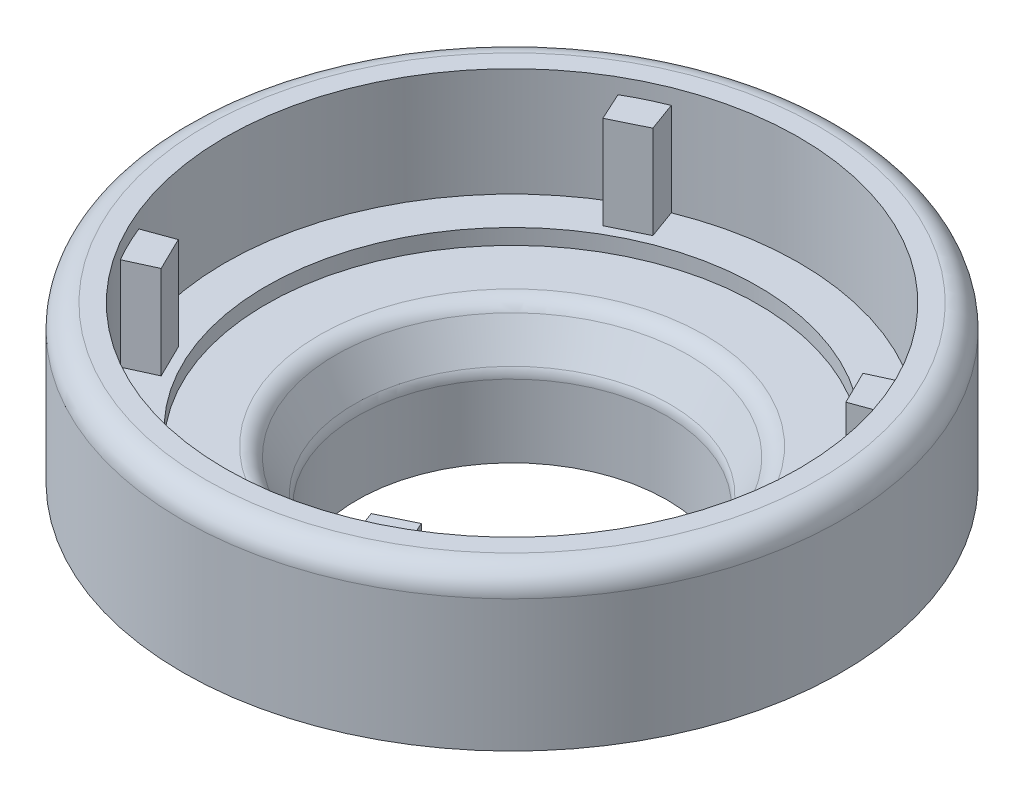
ISO-10303-21;
HEADER;
FILE_DESCRIPTION(('STEP AP214'),'2;1');
FILE_NAME('part.step','',(''),(''),'','','');
FILE_SCHEMA(('AUTOMOTIVE_DESIGN { 1 0 10303 214 1 1 1 1 }'));
ENDSEC;
DATA;
#1=APPLICATION_CONTEXT('core data for automotive mechanical design processes');
#2=APPLICATION_PROTOCOL_DEFINITION('international standard','automotive_design',2000,#1);
#3=PRODUCT_CONTEXT('',#1,'mechanical');
#4=PRODUCT('Part','Part','',(#3));
#5=PRODUCT_RELATED_PRODUCT_CATEGORY('part','',(#4));
#6=PRODUCT_DEFINITION_FORMATION('','',#4);
#7=PRODUCT_DEFINITION_CONTEXT('part definition',#1,'design');
#8=PRODUCT_DEFINITION('design','',#6,#7);
#9=PRODUCT_DEFINITION_SHAPE('','',#8);
#10=(LENGTH_UNIT() NAMED_UNIT(*) SI_UNIT(.MILLI.,.METRE.));
#11=(NAMED_UNIT(*) PLANE_ANGLE_UNIT() SI_UNIT($,.RADIAN.));
#12=(NAMED_UNIT(*) SI_UNIT($,.STERADIAN.) SOLID_ANGLE_UNIT());
#13=UNCERTAINTY_MEASURE_WITH_UNIT(LENGTH_MEASURE(1.E-05),#10,'distance_accuracy_value','');
#14=(GEOMETRIC_REPRESENTATION_CONTEXT(3) GLOBAL_UNCERTAINTY_ASSIGNED_CONTEXT((#13)) GLOBAL_UNIT_ASSIGNED_CONTEXT((#10,
#11,#12)) REPRESENTATION_CONTEXT('',''));
#15=CARTESIAN_POINT('',(0.,0.,0.));
#16=DIRECTION('',(0.,0.,1.));
#17=DIRECTION('',(1.,0.,0.));
#18=AXIS2_PLACEMENT_3D('',#15,#16,#17);
#19=CARTESIAN_POINT('',(0.,16.,0.));
#20=DIRECTION('',(0.,-1.,0.));
#21=DIRECTION('',(0.,0.,-1.));
#22=AXIS2_PLACEMENT_3D('',#19,#20,#21);
#23=CYLINDRICAL_SURFACE('',#22,10.);
#24=CARTESIAN_POINT('',(0.,4.67846096908264,0.));
#25=DIRECTION('',(0.,-1.,0.));
#26=DIRECTION('',(0.,0.,-1.));
#27=AXIS2_PLACEMENT_3D('',#24,#25,#26);
#28=CIRCLE('',#27,10.);
#29=CARTESIAN_POINT('',(0.,4.67846096908264,-10.));
#30=VERTEX_POINT('',#29);
#31=EDGE_CURVE('E362',#30,#30,#28,.F.);
#32=ORIENTED_EDGE('',*,*,#31,.T.);
#33=EDGE_LOOP('',(#32));
#34=FACE_BOUND('',#33,.T.);
#35=CARTESIAN_POINT('',(0.,0.,0.));
#36=DIRECTION('',(0.,1.,0.));
#37=DIRECTION('',(0.,0.,1.));
#38=AXIS2_PLACEMENT_3D('',#35,#36,#37);
#39=CIRCLE('',#38,10.);
#40=CARTESIAN_POINT('',(0.,0.,10.));
#41=VERTEX_POINT('',#40);
#42=EDGE_CURVE('E295',#41,#41,#39,.T.);
#43=ORIENTED_EDGE('',*,*,#42,.F.);
#44=EDGE_LOOP('',(#43));
#45=FACE_BOUND('',#44,.T.);
#46=ADVANCED_FACE('F51',(#34,#45),#23,.F.);
#47=CARTESIAN_POINT('',(0.,16.,0.));
#48=DIRECTION('',(0.,-1.,0.));
#49=DIRECTION('',(0.,0.,-1.));
#50=AXIS2_PLACEMENT_3D('',#47,#48,#49);
#51=CYLINDRICAL_SURFACE('',#50,18.5);
#52=CARTESIAN_POINT('',(0.,16.,0.));
#53=DIRECTION('',(0.,1.,0.));
#54=DIRECTION('',(0.,0.,1.));
#55=AXIS2_PLACEMENT_3D('',#52,#53,#54);
#56=CIRCLE('',#55,18.5);
#57=CARTESIAN_POINT('',(0.,16.,18.5));
#58=VERTEX_POINT('',#57);
#59=EDGE_CURVE('E316',#58,#58,#56,.T.);
#60=ORIENTED_EDGE('',*,*,#59,.T.);
#61=EDGE_LOOP('',(#60));
#62=FACE_BOUND('',#61,.T.);
#63=CARTESIAN_POINT('',(0.,9.,0.));
#64=DIRECTION('',(0.,1.,0.));
#65=DIRECTION('',(0.,0.,1.));
#66=AXIS2_PLACEMENT_3D('',#63,#64,#65);
#67=CIRCLE('',#66,18.5);
#68=CARTESIAN_POINT('',(17.1650207591928,9.,-6.90014944305405));
#69=VERTEX_POINT('',#68);
#70=CARTESIAN_POINT('',(9.21235520511041,9.,16.0431453142729));
#71=VERTEX_POINT('',#70);
#72=EDGE_CURVE('E337',#69,#71,#67,.F.);
#73=ORIENTED_EDGE('',*,*,#72,.T.);
#74=DIRECTION('',(0.,-1.,0.));
#75=VECTOR('',#74,1.);
#76=CARTESIAN_POINT('',(9.21235520511041,20.1835019134062,16.0431453142729));
#77=LINE('',#76,#75);
#78=CARTESIAN_POINT('',(9.21235520511041,15.,16.0431453142729));
#79=VERTEX_POINT('',#78);
#80=EDGE_CURVE('E201',#79,#71,#77,.T.);
#81=ORIENTED_EDGE('',*,*,#80,.F.);
#82=CARTESIAN_POINT('',(0.,15.,0.));
#83=DIRECTION('',(0.,1.,0.));
#84=DIRECTION('',(0.,0.,1.));
#85=AXIS2_PLACEMENT_3D('',#82,#83,#84);
#86=CIRCLE('',#85,18.5);
#87=CARTESIAN_POINT('',(6.90014944305423,15.,17.1650207591928));
#88=VERTEX_POINT('',#87);
#89=EDGE_CURVE('E351',#88,#79,#86,.T.);
#90=ORIENTED_EDGE('',*,*,#89,.F.);
#91=DIRECTION('',(0.,-1.,0.));
#92=VECTOR('',#91,1.);
#93=CARTESIAN_POINT('',(6.90014944305423,20.1835019134062,17.1650207591928));
#94=LINE('',#93,#92);
#95=CARTESIAN_POINT('',(6.90014944305423,9.,17.1650207591928));
#96=VERTEX_POINT('',#95);
#97=EDGE_CURVE('E177',#88,#96,#94,.T.);
#98=ORIENTED_EDGE('',*,*,#97,.T.);
#99=CARTESIAN_POINT('',(-16.0431453142729,9.,9.21235520511024));
#100=VERTEX_POINT('',#99);
#101=EDGE_CURVE('E342',#96,#100,#67,.F.);
#102=ORIENTED_EDGE('',*,*,#101,.T.);
#103=DIRECTION('',(0.,-1.,0.));
#104=VECTOR('',#103,1.);
#105=CARTESIAN_POINT('',(-16.0431453142729,20.1835019134061,9.21235520511024));
#106=LINE('',#105,#104);
#107=CARTESIAN_POINT('',(-16.0431453142729,15.,9.21235520511024));
#108=VERTEX_POINT('',#107);
#109=EDGE_CURVE('E193',#108,#100,#106,.T.);
#110=ORIENTED_EDGE('',*,*,#109,.F.);
#111=CARTESIAN_POINT('',(0.,15.,0.));
#112=DIRECTION('',(0.,1.,0.));
#113=DIRECTION('',(0.,0.,1.));
#114=AXIS2_PLACEMENT_3D('',#111,#112,#113);
#115=CIRCLE('',#114,18.5);
#116=CARTESIAN_POINT('',(-17.1650207591928,15.,6.90014944305405));
#117=VERTEX_POINT('',#116);
#118=EDGE_CURVE('E348',#117,#108,#115,.T.);
#119=ORIENTED_EDGE('',*,*,#118,.F.);
#120=DIRECTION('',(0.,-1.,0.));
#121=VECTOR('',#120,1.);
#122=CARTESIAN_POINT('',(-17.1650207591928,20.1835019134061,6.90014944305405));
#123=LINE('',#122,#121);
#124=CARTESIAN_POINT('',(-17.1650207591928,9.,6.90014944305405));
#125=VERTEX_POINT('',#124);
#126=EDGE_CURVE('E187',#117,#125,#123,.T.);
#127=ORIENTED_EDGE('',*,*,#126,.T.);
#128=CARTESIAN_POINT('',(-9.2123552051103,9.,-16.0431453142729));
#129=VERTEX_POINT('',#128);
#130=EDGE_CURVE('E475',#125,#129,#67,.F.);
#131=ORIENTED_EDGE('',*,*,#130,.T.);
#132=DIRECTION('',(0.,-1.,0.));
#133=VECTOR('',#132,1.);
#134=CARTESIAN_POINT('',(-9.2123552051103,20.1835019134062,-16.0431453142729));
#135=LINE('',#134,#133);
#136=CARTESIAN_POINT('',(-9.2123552051103,15.,-16.0431453142729));
#137=VERTEX_POINT('',#136);
#138=EDGE_CURVE('E253',#137,#129,#135,.T.);
#139=ORIENTED_EDGE('',*,*,#138,.F.);
#140=CARTESIAN_POINT('',(0.,15.,0.));
#141=DIRECTION('',(0.,1.,0.));
#142=DIRECTION('',(0.,0.,1.));
#143=AXIS2_PLACEMENT_3D('',#140,#141,#142);
#144=CIRCLE('',#143,18.5);
#145=CARTESIAN_POINT('',(-6.90014944305411,15.,-17.1650207591928));
#146=VERTEX_POINT('',#145);
#147=EDGE_CURVE('E345',#146,#137,#144,.T.);
#148=ORIENTED_EDGE('',*,*,#147,.F.);
#149=DIRECTION('',(0.,-1.,0.));
#150=VECTOR('',#149,1.);
#151=CARTESIAN_POINT('',(-6.90014944305411,20.1835019134062,-17.1650207591928));
#152=LINE('',#151,#150);
#153=CARTESIAN_POINT('',(-6.90014944305411,9.,-17.1650207591928));
#154=VERTEX_POINT('',#153);
#155=EDGE_CURVE('E225',#146,#154,#152,.T.);
#156=ORIENTED_EDGE('',*,*,#155,.T.);
#157=CARTESIAN_POINT('',(16.0431453142729,9.,-9.21235520511024));
#158=VERTEX_POINT('',#157);
#159=EDGE_CURVE('E333',#154,#158,#67,.F.);
#160=ORIENTED_EDGE('',*,*,#159,.T.);
#161=DIRECTION('',(0.,-1.,0.));
#162=VECTOR('',#161,1.);
#163=CARTESIAN_POINT('',(16.0431453142729,20.1835019134061,-9.21235520511024));
#164=LINE('',#163,#162);
#165=CARTESIAN_POINT('',(16.0431453142729,15.,-9.21235520511024));
#166=VERTEX_POINT('',#165);
#167=EDGE_CURVE('E290',#166,#158,#164,.T.);
#168=ORIENTED_EDGE('',*,*,#167,.F.);
#169=CARTESIAN_POINT('',(0.,15.,0.));
#170=DIRECTION('',(0.,1.,0.));
#171=DIRECTION('',(0.,0.,1.));
#172=AXIS2_PLACEMENT_3D('',#169,#170,#171);
#173=CIRCLE('',#172,18.5);
#174=CARTESIAN_POINT('',(17.1650207591928,15.,-6.90014944305405));
#175=VERTEX_POINT('',#174);
#176=EDGE_CURVE('E341',#175,#166,#173,.T.);
#177=ORIENTED_EDGE('',*,*,#176,.F.);
#178=DIRECTION('',(0.,-1.,0.));
#179=VECTOR('',#178,1.);
#180=CARTESIAN_POINT('',(17.1650207591928,20.1835019134061,-6.90014944305405));
#181=LINE('',#180,#179);
#182=EDGE_CURVE('E258',#175,#69,#181,.T.);
#183=ORIENTED_EDGE('',*,*,#182,.T.);
#184=EDGE_LOOP('',(#73,#81,#90,#98,#102,#110,#119,#127,#131,#139,#148,#156,#160,#168,#177,#183));
#185=FACE_BOUND('',#184,.T.);
#186=ADVANCED_FACE('F395',(#62,#185),#51,.F.);
#187=CARTESIAN_POINT('',(0.,9.,0.));
#188=DIRECTION('',(0.,1.,0.));
#189=DIRECTION('',(0.,0.,1.));
#190=AXIS2_PLACEMENT_3D('',#187,#188,#189);
#191=PLANE('',#190);
#192=CARTESIAN_POINT('',(0.,9.,0.));
#193=DIRECTION('',(0.,1.,0.));
#194=DIRECTION('',(0.,0.,1.));
#195=AXIS2_PLACEMENT_3D('',#192,#193,#194);
#196=CIRCLE('',#195,15.8623997309025);
#197=CARTESIAN_POINT('',(0.,9.,15.8623997309025));
#198=VERTEX_POINT('',#197);
#199=EDGE_CURVE('E467',#198,#198,#196,.T.);
#200=ORIENTED_EDGE('',*,*,#199,.F.);
#201=EDGE_LOOP('',(#200));
#202=FACE_BOUND('',#201,.T.);
#203=DIRECTION('',(-0.897875455413852,0.,0.440249550329547));
#204=VECTOR('',#203,1.);
#205=CARTESIAN_POINT('',(6.22194431081026,9.,15.300741035389));
#206=LINE('',#205,#204);
#207=CARTESIAN_POINT('',(8.3864729236813,9.,14.2394215141279));
#208=VERTEX_POINT('',#207);
#209=CARTESIAN_POINT('',(6.22194431081026,9.,15.300741035389));
#210=VERTEX_POINT('',#209);
#211=EDGE_CURVE('E67',#208,#210,#206,.T.);
#212=ORIENTED_EDGE('',*,*,#211,.F.);
#213=DIRECTION('',(-0.416311233987217,0.,-0.909222171119931));
#214=VECTOR('',#213,1.);
#215=CARTESIAN_POINT('',(8.3864729236813,9.,14.2394215141279));
#216=LINE('',#215,#214);
#217=EDGE_CURVE('E198',#71,#208,#216,.T.);
#218=ORIENTED_EDGE('',*,*,#217,.F.);
#219=ORIENTED_EDGE('',*,*,#72,.F.);
#220=DIRECTION('',(0.939747237307346,0.,-0.341870048371029));
#221=VECTOR('',#220,1.);
#222=CARTESIAN_POINT('',(17.1650207591928,9.,-6.90014944305405));
#223=LINE('',#222,#221);
#224=CARTESIAN_POINT('',(15.3007410353891,9.,-6.2219443108101));
#225=VERTEX_POINT('',#224);
#226=EDGE_CURVE('E277',#225,#69,#223,.T.);
#227=ORIENTED_EDGE('',*,*,#226,.F.);
#228=DIRECTION('',(0.440249550329537,0.,0.897875455413856));
#229=VECTOR('',#228,1.);
#230=CARTESIAN_POINT('',(15.3007410353891,9.,-6.2219443108101));
#231=LINE('',#230,#229);
#232=CARTESIAN_POINT('',(14.239421514128,9.,-8.38647292368115));
#233=VERTEX_POINT('',#232);
#234=EDGE_CURVE('E282',#233,#225,#231,.T.);
#235=ORIENTED_EDGE('',*,*,#234,.F.);
#236=DIRECTION('',(-0.909222171119935,0.,0.416311233987208));
#237=VECTOR('',#236,1.);
#238=CARTESIAN_POINT('',(14.239421514128,9.,-8.38647292368115));
#239=LINE('',#238,#237);
#240=EDGE_CURVE('E286',#158,#233,#239,.T.);
#241=ORIENTED_EDGE('',*,*,#240,.F.);
#242=ORIENTED_EDGE('',*,*,#159,.F.);
#243=DIRECTION('',(-0.341870048371032,0.,-0.939747237307345));
#244=VECTOR('',#243,1.);
#245=CARTESIAN_POINT('',(-6.90014944305411,9.,-17.1650207591928));
#246=LINE('',#245,#244);
#247=CARTESIAN_POINT('',(-6.22194431081015,9.,-15.300741035389));
#248=VERTEX_POINT('',#247);
#249=EDGE_CURVE('E240',#248,#154,#246,.T.);
#250=ORIENTED_EDGE('',*,*,#249,.F.);
#251=DIRECTION('',(0.897875455413855,0.,-0.44024955032954));
#252=VECTOR('',#251,1.);
#253=CARTESIAN_POINT('',(-6.22194431081015,9.,-15.300741035389));
#254=LINE('',#253,#252);
#255=CARTESIAN_POINT('',(-8.3864729236812,9.,-14.239421514128));
#256=VERTEX_POINT('',#255);
#257=EDGE_CURVE('E245',#256,#248,#254,.T.);
#258=ORIENTED_EDGE('',*,*,#257,.F.);
#259=DIRECTION('',(0.416311233987211,0.,0.909222171119933));
#260=VECTOR('',#259,1.);
#261=CARTESIAN_POINT('',(-8.3864729236812,9.,-14.239421514128));
#262=LINE('',#261,#260);
#263=EDGE_CURVE('E249',#129,#256,#262,.T.);
#264=ORIENTED_EDGE('',*,*,#263,.F.);
#265=ORIENTED_EDGE('',*,*,#130,.F.);
#266=DIRECTION('',(-0.939747237307346,0.,0.341870048371029));
#267=VECTOR('',#266,1.);
#268=CARTESIAN_POINT('',(-17.1650207591928,9.,6.90014944305405));
#269=LINE('',#268,#267);
#270=CARTESIAN_POINT('',(-15.3007410353891,9.,6.2219443108101));
#271=VERTEX_POINT('',#270);
#272=EDGE_CURVE('E209',#271,#125,#269,.T.);
#273=ORIENTED_EDGE('',*,*,#272,.F.);
#274=DIRECTION('',(-0.440249550329537,0.,-0.897875455413856));
#275=VECTOR('',#274,1.);
#276=CARTESIAN_POINT('',(-15.3007410353891,9.,6.2219443108101));
#277=LINE('',#276,#275);
#278=CARTESIAN_POINT('',(-14.239421514128,9.,8.38647292368115));
#279=VERTEX_POINT('',#278);
#280=EDGE_CURVE('E75',#279,#271,#277,.T.);
#281=ORIENTED_EDGE('',*,*,#280,.F.);
#282=DIRECTION('',(0.909222171119935,0.,-0.416311233987208));
#283=VECTOR('',#282,1.);
#284=CARTESIAN_POINT('',(-14.239421514128,9.,8.38647292368115));
#285=LINE('',#284,#283);
#286=EDGE_CURVE('E217',#100,#279,#285,.T.);
#287=ORIENTED_EDGE('',*,*,#286,.F.);
#288=ORIENTED_EDGE('',*,*,#101,.F.);
#289=DIRECTION('',(0.341870048371039,0.,0.939747237307343));
#290=VECTOR('',#289,1.);
#291=CARTESIAN_POINT('',(6.90014944305423,9.,17.1650207591928));
#292=LINE('',#291,#290);
#293=EDGE_CURVE('E171',#210,#96,#292,.T.);
#294=ORIENTED_EDGE('',*,*,#293,.F.);
#295=EDGE_LOOP('',(#212,#218,#219,#227,#235,#241,#242,#250,#258,#264,#265,#273,#281,#287,#288,#294));
#296=FACE_BOUND('',#295,.T.);
#297=ADVANCED_FACE('F401',(#202,#296),#191,.T.);
#298=CARTESIAN_POINT('',(0.,5.,0.));
#299=DIRECTION('',(0.,-1.,0.));
#300=DIRECTION('',(0.,0.,-1.));
#301=AXIS2_PLACEMENT_3D('',#298,#299,#300);
#302=CYLINDRICAL_SURFACE('',#301,12.);
#303=CARTESIAN_POINT('',(0.,5.,0.));
#304=DIRECTION('',(0.,1.,0.));
#305=DIRECTION('',(0.,0.,1.));
#306=AXIS2_PLACEMENT_3D('',#303,#304,#305);
#307=CIRCLE('',#306,12.);
#308=CARTESIAN_POINT('',(0.,5.,12.));
#309=VERTEX_POINT('',#308);
#310=EDGE_CURVE('E329',#309,#309,#307,.T.);
#311=ORIENTED_EDGE('',*,*,#310,.F.);
#312=EDGE_LOOP('',(#311));
#313=FACE_BOUND('',#312,.T.);
#314=CARTESIAN_POINT('',(0.,0.,0.));
#315=DIRECTION('',(0.,1.,0.));
#316=DIRECTION('',(0.,0.,1.));
#317=AXIS2_PLACEMENT_3D('',#314,#315,#316);
#318=CIRCLE('',#317,12.);
#319=CARTESIAN_POINT('',(0.,0.,12.));
#320=VERTEX_POINT('',#319);
#321=EDGE_CURVE('E328',#320,#320,#318,.T.);
#322=ORIENTED_EDGE('',*,*,#321,.T.);
#323=EDGE_LOOP('',(#322));
#324=FACE_BOUND('',#323,.T.);
#325=ADVANCED_FACE('F415',(#313,#324),#302,.T.);
#326=CARTESIAN_POINT('',(0.,0.,0.));
#327=DIRECTION('',(0.,1.,0.));
#328=DIRECTION('',(0.,0.,1.));
#329=AXIS2_PLACEMENT_3D('',#326,#327,#328);
#330=PLANE('',#329);
#331=ORIENTED_EDGE('',*,*,#42,.T.);
#332=EDGE_LOOP('',(#331));
#333=FACE_BOUND('',#332,.T.);
#334=ORIENTED_EDGE('',*,*,#321,.F.);
#335=EDGE_LOOP('',(#334));
#336=FACE_BOUND('',#335,.T.);
#337=ADVANCED_FACE('F430',(#333,#336),#330,.F.);
#338=CARTESIAN_POINT('',(0.,6.,0.));
#339=DIRECTION('',(0.,-1.,0.));
#340=DIRECTION('',(0.,0.,-1.));
#341=AXIS2_PLACEMENT_3D('',#338,#339,#340);
#342=CYLINDRICAL_SURFACE('',#341,12.5);
#343=CARTESIAN_POINT('',(0.,5.30000000000001,0.));
#344=DIRECTION('',(0.,1.,0.));
#345=DIRECTION('',(0.,0.,1.));
#346=AXIS2_PLACEMENT_3D('',#343,#344,#345);
#347=CIRCLE('',#346,12.5);
#348=CARTESIAN_POINT('',(0.,5.30000000000001,12.5));
#349=VERTEX_POINT('',#348);
#350=EDGE_CURVE('E358',#349,#349,#347,.F.);
#351=ORIENTED_EDGE('',*,*,#350,.T.);
#352=EDGE_LOOP('',(#351));
#353=FACE_BOUND('',#352,.T.);
#354=CARTESIAN_POINT('',(0.,5.,0.));
#355=DIRECTION('',(0.,1.,0.));
#356=DIRECTION('',(0.,0.,1.));
#357=AXIS2_PLACEMENT_3D('',#354,#355,#356);
#358=CIRCLE('',#357,12.5);
#359=CARTESIAN_POINT('',(0.,5.,12.5));
#360=VERTEX_POINT('',#359);
#361=EDGE_CURVE('E324',#360,#360,#358,.T.);
#362=ORIENTED_EDGE('',*,*,#361,.T.);
#363=EDGE_LOOP('',(#362));
#364=FACE_BOUND('',#363,.T.);
#365=ADVANCED_FACE('F426',(#353,#364),#342,.T.);
#366=CARTESIAN_POINT('',(0.,5.,0.));
#367=DIRECTION('',(0.,1.,0.));
#368=DIRECTION('',(0.,0.,1.));
#369=AXIS2_PLACEMENT_3D('',#366,#367,#368);
#370=PLANE('',#369);
#371=ORIENTED_EDGE('',*,*,#310,.T.);
#372=EDGE_LOOP('',(#371));
#373=FACE_BOUND('',#372,.T.);
#374=ORIENTED_EDGE('',*,*,#361,.F.);
#375=EDGE_LOOP('',(#374));
#376=FACE_BOUND('',#375,.T.);
#377=ADVANCED_FACE('F419',(#373,#376),#370,.F.);
#378=CARTESIAN_POINT('',(0.,6.,0.));
#379=DIRECTION('',(0.,1.,0.));
#380=DIRECTION('',(0.,0.,1.));
#381=AXIS2_PLACEMENT_3D('',#378,#379,#380);
#382=PLANE('',#381);
#383=CARTESIAN_POINT('',(0.,6.,0.));
#384=DIRECTION('',(0.,1.,0.));
#385=DIRECTION('',(0.,0.,1.));
#386=AXIS2_PLACEMENT_3D('',#383,#384,#385);
#387=CIRCLE('',#386,13.9352126891055);
#388=CARTESIAN_POINT('',(0.,6.,13.9352126891055));
#389=VERTEX_POINT('',#388);
#390=EDGE_CURVE('E354',#389,#389,#387,.T.);
#391=ORIENTED_EDGE('',*,*,#390,.T.);
#392=EDGE_LOOP('',(#391));
#393=FACE_BOUND('',#392,.T.);
#394=CARTESIAN_POINT('',(0.,6.,0.));
#395=DIRECTION('',(0.,1.,0.));
#396=DIRECTION('',(0.,0.,1.));
#397=AXIS2_PLACEMENT_3D('',#394,#395,#396);
#398=CIRCLE('',#397,21.25);
#399=CARTESIAN_POINT('',(0.,6.,21.25));
#400=VERTEX_POINT('',#399);
#401=EDGE_CURVE('E320',#400,#400,#398,.T.);
#402=ORIENTED_EDGE('',*,*,#401,.F.);
#403=EDGE_LOOP('',(#402));
#404=FACE_BOUND('',#403,.T.);
#405=ADVANCED_FACE('F412',(#393,#404),#382,.F.);
#406=CARTESIAN_POINT('',(0.,9.,0.));
#407=DIRECTION('',(0.,-1.,0.));
#408=DIRECTION('',(0.,0.,-1.));
#409=AXIS2_PLACEMENT_3D('',#406,#407,#408);
#410=CYLINDRICAL_SURFACE('',#409,21.25);
#411=CARTESIAN_POINT('',(0.,14.5,0.));
#412=DIRECTION('',(0.,1.,0.));
#413=DIRECTION('',(0.,0.,1.));
#414=AXIS2_PLACEMENT_3D('',#411,#412,#413);
#415=CIRCLE('',#414,21.25);
#416=CARTESIAN_POINT('',(0.,14.5,21.25));
#417=VERTEX_POINT('',#416);
#418=EDGE_CURVE('E13',#417,#417,#415,.F.);
#419=ORIENTED_EDGE('',*,*,#418,.T.);
#420=EDGE_LOOP('',(#419));
#421=FACE_BOUND('',#420,.T.);
#422=ORIENTED_EDGE('',*,*,#401,.T.);
#423=EDGE_LOOP('',(#422));
#424=FACE_BOUND('',#423,.T.);
#425=ADVANCED_FACE('F411',(#421,#424),#410,.T.);
#426=CARTESIAN_POINT('',(0.,16.,0.));
#427=DIRECTION('',(0.,1.,0.));
#428=DIRECTION('',(0.,0.,1.));
#429=AXIS2_PLACEMENT_3D('',#426,#427,#428);
#430=PLANE('',#429);
#431=CARTESIAN_POINT('',(0.,16.,0.));
#432=DIRECTION('',(0.,1.,0.));
#433=DIRECTION('',(0.,0.,1.));
#434=AXIS2_PLACEMENT_3D('',#431,#432,#433);
#435=CIRCLE('',#434,19.75);
#436=CARTESIAN_POINT('',(0.,16.,19.75));
#437=VERTEX_POINT('',#436);
#438=EDGE_CURVE('E60',#437,#437,#435,.T.);
#439=ORIENTED_EDGE('',*,*,#438,.T.);
#440=EDGE_LOOP('',(#439));
#441=FACE_BOUND('',#440,.T.);
#442=ORIENTED_EDGE('',*,*,#59,.F.);
#443=EDGE_LOOP('',(#442));
#444=FACE_BOUND('',#443,.T.);
#445=ADVANCED_FACE('F382',(#441,#444),#430,.T.);
#446=CARTESIAN_POINT('',(0.,15.,0.));
#447=DIRECTION('',(0.,1.,0.));
#448=DIRECTION('',(0.,0.,1.));
#449=AXIS2_PLACEMENT_3D('',#446,#447,#448);
#450=PLANE('',#449);
#451=DIRECTION('',(0.939747237307347,0.,-0.341870048371029));
#452=VECTOR('',#451,1.);
#453=CARTESIAN_POINT('',(17.1650207591928,15.,-6.90014944305405));
#454=LINE('',#453,#452);
#455=CARTESIAN_POINT('',(15.3007410353891,15.,-6.2219443108101));
#456=VERTEX_POINT('',#455);
#457=EDGE_CURVE('E280',#456,#175,#454,.T.);
#458=ORIENTED_EDGE('',*,*,#457,.T.);
#459=ORIENTED_EDGE('',*,*,#176,.T.);
#460=DIRECTION('',(-0.909222171119935,0.,0.416311233987208));
#461=VECTOR('',#460,1.);
#462=CARTESIAN_POINT('',(14.239421514128,15.,-8.38647292368115));
#463=LINE('',#462,#461);
#464=CARTESIAN_POINT('',(14.239421514128,15.,-8.38647292368115));
#465=VERTEX_POINT('',#464);
#466=EDGE_CURVE('E296',#166,#465,#463,.T.);
#467=ORIENTED_EDGE('',*,*,#466,.T.);
#468=DIRECTION('',(0.440249550329537,0.,0.897875455413856));
#469=VECTOR('',#468,1.);
#470=CARTESIAN_POINT('',(15.3007410353891,15.,-6.2219443108101));
#471=LINE('',#470,#469);
#472=EDGE_CURVE('E291',#465,#456,#471,.T.);
#473=ORIENTED_EDGE('',*,*,#472,.T.);
#474=EDGE_LOOP('',(#458,#459,#467,#473));
#475=FACE_BOUND('',#474,.T.);
#476=ADVANCED_FACE('F406',(#475),#450,.T.);
#477=CARTESIAN_POINT('',(14.239421514128,20.1835019134061,-8.38647292368115));
#478=DIRECTION('',(0.416311233987208,0.,0.909222171119935));
#479=DIRECTION('',(0.909222171119935,0.,-0.416311233987208));
#480=AXIS2_PLACEMENT_3D('',#477,#478,#479);
#481=PLANE('',#480);
#482=ORIENTED_EDGE('',*,*,#466,.F.);
#483=ORIENTED_EDGE('',*,*,#167,.T.);
#484=ORIENTED_EDGE('',*,*,#240,.T.);
#485=DIRECTION('',(0.,-1.,0.));
#486=VECTOR('',#485,1.);
#487=CARTESIAN_POINT('',(14.239421514128,20.1835019134061,-8.38647292368115));
#488=LINE('',#487,#486);
#489=EDGE_CURVE('E285',#465,#233,#488,.T.);
#490=ORIENTED_EDGE('',*,*,#489,.F.);
#491=EDGE_LOOP('',(#482,#483,#484,#490));
#492=FACE_BOUND('',#491,.T.);
#493=ADVANCED_FACE('F487',(#492),#481,.F.);
#494=CARTESIAN_POINT('',(15.3007410353891,20.1835019134061,-6.2219443108101));
#495=DIRECTION('',(0.897875455413856,0.,-0.440249550329537));
#496=DIRECTION('',(-0.440249550329537,0.,-0.897875455413856));
#497=AXIS2_PLACEMENT_3D('',#494,#495,#496);
#498=PLANE('',#497);
#499=ORIENTED_EDGE('',*,*,#472,.F.);
#500=ORIENTED_EDGE('',*,*,#489,.T.);
#501=ORIENTED_EDGE('',*,*,#234,.T.);
#502=DIRECTION('',(0.,-1.,0.));
#503=VECTOR('',#502,1.);
#504=CARTESIAN_POINT('',(15.3007410353891,20.1835019134061,-6.2219443108101));
#505=LINE('',#504,#503);
#506=EDGE_CURVE('E281',#456,#225,#505,.T.);
#507=ORIENTED_EDGE('',*,*,#506,.F.);
#508=EDGE_LOOP('',(#499,#500,#501,#507));
#509=FACE_BOUND('',#508,.T.);
#510=ADVANCED_FACE('F493',(#509),#498,.F.);
#511=CARTESIAN_POINT('',(17.1650207591928,20.1835019134061,-6.90014944305405));
#512=DIRECTION('',(-0.341870048371029,0.,-0.939747237307347));
#513=DIRECTION('',(-0.939747237307347,0.,0.341870048371029));
#514=AXIS2_PLACEMENT_3D('',#511,#512,#513);
#515=PLANE('',#514);
#516=ORIENTED_EDGE('',*,*,#457,.F.);
#517=ORIENTED_EDGE('',*,*,#506,.T.);
#518=ORIENTED_EDGE('',*,*,#226,.T.);
#519=ORIENTED_EDGE('',*,*,#182,.F.);
#520=EDGE_LOOP('',(#516,#517,#518,#519));
#521=FACE_BOUND('',#520,.T.);
#522=ADVANCED_FACE('F496',(#521),#515,.F.);
#523=CARTESIAN_POINT('',(0.,15.,0.));
#524=DIRECTION('',(0.,1.,0.));
#525=DIRECTION('',(0.,0.,1.));
#526=AXIS2_PLACEMENT_3D('',#523,#524,#525);
#527=PLANE('',#526);
#528=DIRECTION('',(-0.341870048371032,0.,-0.939747237307345));
#529=VECTOR('',#528,1.);
#530=CARTESIAN_POINT('',(-6.90014944305411,15.,-17.1650207591928));
#531=LINE('',#530,#529);
#532=CARTESIAN_POINT('',(-6.22194431081015,15.,-15.300741035389));
#533=VERTEX_POINT('',#532);
#534=EDGE_CURVE('E243',#533,#146,#531,.T.);
#535=ORIENTED_EDGE('',*,*,#534,.T.);
#536=ORIENTED_EDGE('',*,*,#147,.T.);
#537=DIRECTION('',(0.416311233987211,0.,0.909222171119934));
#538=VECTOR('',#537,1.);
#539=CARTESIAN_POINT('',(-8.3864729236812,15.,-14.239421514128));
#540=LINE('',#539,#538);
#541=CARTESIAN_POINT('',(-8.3864729236812,15.,-14.239421514128));
#542=VERTEX_POINT('',#541);
#543=EDGE_CURVE('E259',#137,#542,#540,.T.);
#544=ORIENTED_EDGE('',*,*,#543,.T.);
#545=DIRECTION('',(0.897875455413855,0.,-0.440249550329541));
#546=VECTOR('',#545,1.);
#547=CARTESIAN_POINT('',(-6.22194431081015,15.,-15.300741035389));
#548=LINE('',#547,#546);
#549=EDGE_CURVE('E254',#542,#533,#548,.T.);
#550=ORIENTED_EDGE('',*,*,#549,.T.);
#551=EDGE_LOOP('',(#535,#536,#544,#550));
#552=FACE_BOUND('',#551,.T.);
#553=ADVANCED_FACE('F528',(#552),#527,.T.);
#554=CARTESIAN_POINT('',(-8.3864729236812,20.1835019134062,-14.239421514128));
#555=DIRECTION('',(0.909222171119933,0.,-0.416311233987211));
#556=DIRECTION('',(-0.416311233987211,0.,-0.909222171119934));
#557=AXIS2_PLACEMENT_3D('',#554,#555,#556);
#558=PLANE('',#557);
#559=ORIENTED_EDGE('',*,*,#543,.F.);
#560=ORIENTED_EDGE('',*,*,#138,.T.);
#561=ORIENTED_EDGE('',*,*,#263,.T.);
#562=DIRECTION('',(0.,-1.,0.));
#563=VECTOR('',#562,1.);
#564=CARTESIAN_POINT('',(-8.3864729236812,20.1835019134062,-14.239421514128));
#565=LINE('',#564,#563);
#566=EDGE_CURVE('E248',#542,#256,#565,.T.);
#567=ORIENTED_EDGE('',*,*,#566,.F.);
#568=EDGE_LOOP('',(#559,#560,#561,#567));
#569=FACE_BOUND('',#568,.T.);
#570=ADVANCED_FACE('F525',(#569),#558,.F.);
#571=CARTESIAN_POINT('',(-6.22194431081015,20.1835019134062,-15.300741035389));
#572=DIRECTION('',(-0.44024955032954,0.,-0.897875455413855));
#573=DIRECTION('',(-0.897875455413855,0.,0.440249550329541));
#574=AXIS2_PLACEMENT_3D('',#571,#572,#573);
#575=PLANE('',#574);
#576=ORIENTED_EDGE('',*,*,#549,.F.);
#577=ORIENTED_EDGE('',*,*,#566,.T.);
#578=ORIENTED_EDGE('',*,*,#257,.T.);
#579=DIRECTION('',(0.,-1.,0.));
#580=VECTOR('',#579,1.);
#581=CARTESIAN_POINT('',(-6.22194431081015,20.1835019134062,-15.300741035389));
#582=LINE('',#581,#580);
#583=EDGE_CURVE('E244',#533,#248,#582,.T.);
#584=ORIENTED_EDGE('',*,*,#583,.F.);
#585=EDGE_LOOP('',(#576,#577,#578,#584));
#586=FACE_BOUND('',#585,.T.);
#587=ADVANCED_FACE('F533',(#586),#575,.F.);
#588=CARTESIAN_POINT('',(-6.90014944305411,20.1835019134062,-17.1650207591928));
#589=DIRECTION('',(-0.939747237307345,0.,0.341870048371032));
#590=DIRECTION('',(0.341870048371032,0.,0.939747237307345));
#591=AXIS2_PLACEMENT_3D('',#588,#589,#590);
#592=PLANE('',#591);
#593=ORIENTED_EDGE('',*,*,#534,.F.);
#594=ORIENTED_EDGE('',*,*,#583,.T.);
#595=ORIENTED_EDGE('',*,*,#249,.T.);
#596=ORIENTED_EDGE('',*,*,#155,.F.);
#597=EDGE_LOOP('',(#593,#594,#595,#596));
#598=FACE_BOUND('',#597,.T.);
#599=ADVANCED_FACE('F531',(#598),#592,.F.);
#600=CARTESIAN_POINT('',(0.,15.,0.));
#601=DIRECTION('',(0.,1.,0.));
#602=DIRECTION('',(0.,0.,1.));
#603=AXIS2_PLACEMENT_3D('',#600,#601,#602);
#604=PLANE('',#603);
#605=DIRECTION('',(-0.939747237307347,0.,0.341870048371029));
#606=VECTOR('',#605,1.);
#607=CARTESIAN_POINT('',(-17.1650207591928,15.,6.90014944305405));
#608=LINE('',#607,#606);
#609=CARTESIAN_POINT('',(-15.3007410353891,15.,6.2219443108101));
#610=VERTEX_POINT('',#609);
#611=EDGE_CURVE('E212',#610,#117,#608,.T.);
#612=ORIENTED_EDGE('',*,*,#611,.T.);
#613=ORIENTED_EDGE('',*,*,#118,.T.);
#614=DIRECTION('',(0.909222171119935,0.,-0.416311233987208));
#615=VECTOR('',#614,1.);
#616=CARTESIAN_POINT('',(-14.239421514128,15.,8.38647292368115));
#617=LINE('',#616,#615);
#618=CARTESIAN_POINT('',(-14.239421514128,15.,8.38647292368115));
#619=VERTEX_POINT('',#618);
#620=EDGE_CURVE('E226',#108,#619,#617,.T.);
#621=ORIENTED_EDGE('',*,*,#620,.T.);
#622=DIRECTION('',(-0.440249550329537,0.,-0.897875455413856));
#623=VECTOR('',#622,1.);
#624=CARTESIAN_POINT('',(-15.3007410353891,15.,6.2219443108101));
#625=LINE('',#624,#623);
#626=EDGE_CURVE('E221',#619,#610,#625,.T.);
#627=ORIENTED_EDGE('',*,*,#626,.T.);
#628=EDGE_LOOP('',(#612,#613,#621,#627));
#629=FACE_BOUND('',#628,.T.);
#630=ADVANCED_FACE('F516',(#629),#604,.T.);
#631=CARTESIAN_POINT('',(-14.239421514128,20.1835019134061,8.38647292368115));
#632=DIRECTION('',(-0.416311233987208,0.,-0.909222171119935));
#633=DIRECTION('',(-0.909222171119935,0.,0.416311233987208));
#634=AXIS2_PLACEMENT_3D('',#631,#632,#633);
#635=PLANE('',#634);
#636=ORIENTED_EDGE('',*,*,#620,.F.);
#637=ORIENTED_EDGE('',*,*,#109,.T.);
#638=ORIENTED_EDGE('',*,*,#286,.T.);
#639=DIRECTION('',(0.,-1.,0.));
#640=VECTOR('',#639,1.);
#641=CARTESIAN_POINT('',(-14.239421514128,20.1835019134061,8.38647292368115));
#642=LINE('',#641,#640);
#643=EDGE_CURVE('E216',#619,#279,#642,.T.);
#644=ORIENTED_EDGE('',*,*,#643,.F.);
#645=EDGE_LOOP('',(#636,#637,#638,#644));
#646=FACE_BOUND('',#645,.T.);
#647=ADVANCED_FACE('F512',(#646),#635,.F.);
#648=CARTESIAN_POINT('',(-15.3007410353891,20.1835019134061,6.2219443108101));
#649=DIRECTION('',(-0.897875455413856,0.,0.440249550329537));
#650=DIRECTION('',(0.440249550329537,0.,0.897875455413856));
#651=AXIS2_PLACEMENT_3D('',#648,#649,#650);
#652=PLANE('',#651);
#653=ORIENTED_EDGE('',*,*,#626,.F.);
#654=ORIENTED_EDGE('',*,*,#643,.T.);
#655=ORIENTED_EDGE('',*,*,#280,.T.);
#656=DIRECTION('',(0.,-1.,0.));
#657=VECTOR('',#656,1.);
#658=CARTESIAN_POINT('',(-15.3007410353891,20.1835019134061,6.2219443108101));
#659=LINE('',#658,#657);
#660=EDGE_CURVE('E213',#610,#271,#659,.T.);
#661=ORIENTED_EDGE('',*,*,#660,.F.);
#662=EDGE_LOOP('',(#653,#654,#655,#661));
#663=FACE_BOUND('',#662,.T.);
#664=ADVANCED_FACE('F703',(#663),#652,.F.);
#665=CARTESIAN_POINT('',(-17.1650207591928,20.1835019134061,6.90014944305405));
#666=DIRECTION('',(0.341870048371029,0.,0.939747237307347));
#667=DIRECTION('',(0.939747237307347,0.,-0.341870048371029));
#668=AXIS2_PLACEMENT_3D('',#665,#666,#667);
#669=PLANE('',#668);
#670=ORIENTED_EDGE('',*,*,#611,.F.);
#671=ORIENTED_EDGE('',*,*,#660,.T.);
#672=ORIENTED_EDGE('',*,*,#272,.T.);
#673=ORIENTED_EDGE('',*,*,#126,.F.);
#674=EDGE_LOOP('',(#670,#671,#672,#673));
#675=FACE_BOUND('',#674,.T.);
#676=ADVANCED_FACE('F519',(#675),#669,.F.);
#677=CARTESIAN_POINT('',(0.,15.,0.));
#678=DIRECTION('',(0.,1.,0.));
#679=DIRECTION('',(0.,0.,1.));
#680=AXIS2_PLACEMENT_3D('',#677,#678,#679);
#681=PLANE('',#680);
#682=DIRECTION('',(0.341870048371039,0.,0.939747237307343));
#683=VECTOR('',#682,1.);
#684=CARTESIAN_POINT('',(6.90014944305423,15.,17.1650207591928));
#685=LINE('',#684,#683);
#686=CARTESIAN_POINT('',(6.22194431081026,15.,15.300741035389));
#687=VERTEX_POINT('',#686);
#688=EDGE_CURVE('E174',#687,#88,#685,.T.);
#689=ORIENTED_EDGE('',*,*,#688,.T.);
#690=ORIENTED_EDGE('',*,*,#89,.T.);
#691=DIRECTION('',(-0.416311233987217,0.,-0.909222171119931));
#692=VECTOR('',#691,1.);
#693=CARTESIAN_POINT('',(8.3864729236813,15.,14.2394215141279));
#694=LINE('',#693,#692);
#695=CARTESIAN_POINT('',(8.3864729236813,15.,14.2394215141279));
#696=VERTEX_POINT('',#695);
#697=EDGE_CURVE('E181',#79,#696,#694,.T.);
#698=ORIENTED_EDGE('',*,*,#697,.T.);
#699=DIRECTION('',(-0.897875455413852,0.,0.440249550329547));
#700=VECTOR('',#699,1.);
#701=CARTESIAN_POINT('',(6.22194431081026,15.,15.300741035389));
#702=LINE('',#701,#700);
#703=EDGE_CURVE('E166',#696,#687,#702,.T.);
#704=ORIENTED_EDGE('',*,*,#703,.T.);
#705=EDGE_LOOP('',(#689,#690,#698,#704));
#706=FACE_BOUND('',#705,.T.);
#707=ADVANCED_FACE('F184',(#706),#681,.T.);
#708=CARTESIAN_POINT('',(8.3864729236813,20.1835019134062,14.2394215141279));
#709=DIRECTION('',(-0.909222171119931,0.,0.416311233987217));
#710=DIRECTION('',(0.416311233987217,0.,0.909222171119931));
#711=AXIS2_PLACEMENT_3D('',#708,#709,#710);
#712=PLANE('',#711);
#713=ORIENTED_EDGE('',*,*,#697,.F.);
#714=ORIENTED_EDGE('',*,*,#80,.T.);
#715=ORIENTED_EDGE('',*,*,#217,.T.);
#716=DIRECTION('',(0.,-1.,0.));
#717=VECTOR('',#716,1.);
#718=CARTESIAN_POINT('',(8.3864729236813,20.1835019134062,14.2394215141279));
#719=LINE('',#718,#717);
#720=EDGE_CURVE('E204',#696,#208,#719,.T.);
#721=ORIENTED_EDGE('',*,*,#720,.F.);
#722=EDGE_LOOP('',(#713,#714,#715,#721));
#723=FACE_BOUND('',#722,.T.);
#724=ADVANCED_FACE('F503',(#723),#712,.F.);
#725=CARTESIAN_POINT('',(6.22194431081026,20.1835019134062,15.300741035389));
#726=DIRECTION('',(0.440249550329547,0.,0.897875455413852));
#727=DIRECTION('',(0.897875455413852,0.,-0.440249550329547));
#728=AXIS2_PLACEMENT_3D('',#725,#726,#727);
#729=PLANE('',#728);
#730=ORIENTED_EDGE('',*,*,#703,.F.);
#731=ORIENTED_EDGE('',*,*,#720,.T.);
#732=ORIENTED_EDGE('',*,*,#211,.T.);
#733=DIRECTION('',(0.,-1.,0.));
#734=VECTOR('',#733,1.);
#735=CARTESIAN_POINT('',(6.22194431081026,20.1835019134062,15.300741035389));
#736=LINE('',#735,#734);
#737=EDGE_CURVE('E162',#687,#210,#736,.T.);
#738=ORIENTED_EDGE('',*,*,#737,.F.);
#739=EDGE_LOOP('',(#730,#731,#732,#738));
#740=FACE_BOUND('',#739,.T.);
#741=ADVANCED_FACE('F164',(#740),#729,.F.);
#742=CARTESIAN_POINT('',(6.90014944305423,20.1835019134062,17.1650207591928));
#743=DIRECTION('',(0.939747237307343,0.,-0.341870048371039));
#744=DIRECTION('',(-0.341870048371039,0.,-0.939747237307343));
#745=AXIS2_PLACEMENT_3D('',#742,#743,#744);
#746=PLANE('',#745);
#747=ORIENTED_EDGE('',*,*,#688,.F.);
#748=ORIENTED_EDGE('',*,*,#737,.T.);
#749=ORIENTED_EDGE('',*,*,#293,.T.);
#750=ORIENTED_EDGE('',*,*,#97,.F.);
#751=EDGE_LOOP('',(#747,#748,#749,#750));
#752=FACE_BOUND('',#751,.T.);
#753=ADVANCED_FACE('F175',(#752),#746,.F.);
#754=CARTESIAN_POINT('',(0.,8.,0.));
#755=DIRECTION('',(0.,1.,0.));
#756=DIRECTION('',(0.,0.,1.));
#757=AXIS2_PLACEMENT_3D('',#754,#755,#756);
#758=PLANE('',#757);
#759=CARTESIAN_POINT('',(0.,8.,0.));
#760=DIRECTION('',(0.,1.,0.));
#761=DIRECTION('',(0.,0.,1.));
#762=AXIS2_PLACEMENT_3D('',#759,#760,#761);
#763=CIRCLE('',#762,12.4248711305964);
#764=CARTESIAN_POINT('',(0.,8.,12.4248711305964));
#765=VERTEX_POINT('',#764);
#766=EDGE_CURVE('E374',#765,#765,#763,.F.);
#767=ORIENTED_EDGE('',*,*,#766,.T.);
#768=EDGE_LOOP('',(#767));
#769=FACE_BOUND('',#768,.T.);
#770=CARTESIAN_POINT('',(0.,8.,0.));
#771=DIRECTION('',(0.,1.,0.));
#772=DIRECTION('',(0.,0.,1.));
#773=AXIS2_PLACEMENT_3D('',#770,#771,#772);
#774=CIRCLE('',#773,15.8623997309025);
#775=CARTESIAN_POINT('',(0.,8.,15.8623997309025));
#776=VERTEX_POINT('',#775);
#777=EDGE_CURVE('E208',#776,#776,#774,.T.);
#778=ORIENTED_EDGE('',*,*,#777,.T.);
#779=EDGE_LOOP('',(#778));
#780=FACE_BOUND('',#779,.T.);
#781=ADVANCED_FACE('F459',(#769,#780),#758,.T.);
#782=CARTESIAN_POINT('',(0.,8.,0.));
#783=DIRECTION('',(0.,1.,0.));
#784=DIRECTION('',(0.,0.,1.));
#785=AXIS2_PLACEMENT_3D('',#782,#783,#784);
#786=CYLINDRICAL_SURFACE('',#785,15.8623997309025);
#787=ORIENTED_EDGE('',*,*,#777,.F.);
#788=EDGE_LOOP('',(#787));
#789=FACE_BOUND('',#788,.T.);
#790=ORIENTED_EDGE('',*,*,#199,.T.);
#791=EDGE_LOOP('',(#790));
#792=FACE_BOUND('',#791,.T.);
#793=ADVANCED_FACE('F442',(#789,#792),#786,.F.);
#794=CARTESIAN_POINT('',(0.,8.,0.));
#795=DIRECTION('',(0.,1.,0.));
#796=DIRECTION('',(0.,0.,1.));
#797=AXIS2_PLACEMENT_3D('',#794,#795,#796);
#798=CONICAL_SURFACE('',#797,11.7320508075689,0.523598775598296);
#799=CARTESIAN_POINT('',(0.,5.27846096908263,0.));
#800=DIRECTION('',(0.,1.,0.));
#801=DIRECTION('',(0.,0.,1.));
#802=AXIS2_PLACEMENT_3D('',#799,#800,#801);
#803=CIRCLE('',#802,10.1607695154587);
#804=CARTESIAN_POINT('',(0.,5.27846096908263,10.1607695154587));
#805=VERTEX_POINT('',#804);
#806=EDGE_CURVE('E370',#805,#805,#803,.F.);
#807=ORIENTED_EDGE('',*,*,#806,.T.);
#808=EDGE_LOOP('',(#807));
#809=FACE_BOUND('',#808,.T.);
#810=CARTESIAN_POINT('',(0.,7.4,0.));
#811=DIRECTION('',(0.,-1.,0.));
#812=DIRECTION('',(0.,0.,-1.));
#813=AXIS2_PLACEMENT_3D('',#810,#811,#812);
#814=CIRCLE('',#813,11.3856406460551);
#815=CARTESIAN_POINT('',(0.,7.4,-11.3856406460551));
#816=VERTEX_POINT('',#815);
#817=EDGE_CURVE('E366',#816,#816,#814,.F.);
#818=ORIENTED_EDGE('',*,*,#817,.T.);
#819=EDGE_LOOP('',(#818));
#820=FACE_BOUND('',#819,.T.);
#821=ADVANCED_FACE('F438',(#809,#820),#798,.F.);
#822=CARTESIAN_POINT('',(0.,6.,0.));
#823=DIRECTION('',(0.,1.,0.));
#824=DIRECTION('',(0.,0.,1.));
#825=AXIS2_PLACEMENT_3D('',#822,#823,#824);
#826=CONICAL_SURFACE('',#825,13.9352126891055,1.11701072127638);
#827=CARTESIAN_POINT('',(0.,5.30000000000001,12.5));
#828=CARTESIAN_POINT('',(0.,5.30729166666667,12.5149501321782));
#829=CARTESIAN_POINT('',(0.,5.31458333333334,12.5299002643564));
#830=CARTESIAN_POINT('',(0.,5.32916666666667,12.5598005287127));
#831=CARTESIAN_POINT('',(0.,5.33645833333334,12.5747506608909));
#832=CARTESIAN_POINT('',(0.,5.35104166666667,12.6046509252473));
#833=CARTESIAN_POINT('',(0.,5.35833333333334,12.6196010574255));
#834=CARTESIAN_POINT('',(0.,5.37291666666667,12.6495013217818));
#835=CARTESIAN_POINT('',(0.,5.38020833333334,12.66445145396));
#836=CARTESIAN_POINT('',(0.,5.39479166666667,12.6943517183164));
#837=CARTESIAN_POINT('',(0.,5.40208333333334,12.7093018504946));
#838=CARTESIAN_POINT('',(0.,5.41666666666667,12.7392021148509));
#839=CARTESIAN_POINT('',(0.,5.42395833333334,12.7541522470291));
#840=CARTESIAN_POINT('',(0.,5.43854166666667,12.7840525113855));
#841=CARTESIAN_POINT('',(0.,5.44583333333334,12.7990026435637));
#842=CARTESIAN_POINT('',(0.,5.46041666666667,12.82890290792));
#843=CARTESIAN_POINT('',(0.,5.46770833333334,12.8438530400982));
#844=CARTESIAN_POINT('',(0.,5.48229166666667,12.8737533044546));
#845=CARTESIAN_POINT('',(0.,5.48958333333334,12.8887034366327));
#846=CARTESIAN_POINT('',(0.,5.50416666666667,12.9186037009891));
#847=CARTESIAN_POINT('',(0.,5.51145833333334,12.9335538331673));
#848=CARTESIAN_POINT('',(0.,5.52604166666667,12.9634540975237));
#849=CARTESIAN_POINT('',(0.,5.53333333333334,12.9784042297018));
#850=CARTESIAN_POINT('',(0.,5.54791666666667,13.0083044940582));
#851=CARTESIAN_POINT('',(0.,5.55520833333334,13.0232546262364));
#852=CARTESIAN_POINT('',(0.,5.56979166666667,13.0531548905928));
#853=CARTESIAN_POINT('',(0.,5.57708333333334,13.0681050227709));
#854=CARTESIAN_POINT('',(0.,5.59166666666667,13.0980052871273));
#855=CARTESIAN_POINT('',(0.,5.59895833333334,13.1129554193055));
#856=CARTESIAN_POINT('',(0.,5.61354166666667,13.1428556836618));
#857=CARTESIAN_POINT('',(0.,5.62083333333334,13.15780581584));
#858=CARTESIAN_POINT('',(0.,5.63541666666667,13.1877060801964));
#859=CARTESIAN_POINT('',(0.,5.64270833333334,13.2026562123746));
#860=CARTESIAN_POINT('',(0.,5.65729166666667,13.2325564767309));
#861=CARTESIAN_POINT('',(0.,5.66458333333334,13.2475066089091));
#862=CARTESIAN_POINT('',(0.,5.67916666666667,13.2774068732655));
#863=CARTESIAN_POINT('',(0.,5.68645833333334,13.2923570054437));
#864=CARTESIAN_POINT('',(0.,5.70104166666667,13.3222572698));
#865=CARTESIAN_POINT('',(0.,5.70833333333333,13.3372074019782));
#866=CARTESIAN_POINT('',(0.,5.72291666666667,13.3671076663346));
#867=CARTESIAN_POINT('',(0.,5.73020833333333,13.3820577985128));
#868=CARTESIAN_POINT('',(0.,5.74479166666667,13.4119580628691));
#869=CARTESIAN_POINT('',(0.,5.75208333333333,13.4269081950473));
#870=CARTESIAN_POINT('',(0.,5.76666666666667,13.4568084594037));
#871=CARTESIAN_POINT('',(0.,5.77395833333333,13.4717585915819));
#872=CARTESIAN_POINT('',(0.,5.78854166666667,13.5016588559382));
#873=CARTESIAN_POINT('',(0.,5.79583333333333,13.5166089881164));
#874=CARTESIAN_POINT('',(0.,5.81041666666667,13.5465092524728));
#875=CARTESIAN_POINT('',(0.,5.81770833333333,13.561459384651));
#876=CARTESIAN_POINT('',(0.,5.83229166666667,13.5913596490073));
#877=CARTESIAN_POINT('',(0.,5.83958333333333,13.6063097811855));
#878=CARTESIAN_POINT('',(0.,5.85416666666667,13.6362100455419));
#879=CARTESIAN_POINT('',(0.,5.86145833333333,13.6511601777201));
#880=CARTESIAN_POINT('',(0.,5.87604166666667,13.6810604420764));
#881=CARTESIAN_POINT('',(0.,5.88333333333333,13.6960105742546));
#882=CARTESIAN_POINT('',(0.,5.89791666666667,13.725910838611));
#883=CARTESIAN_POINT('',(0.,5.90520833333333,13.7408609707892));
#884=CARTESIAN_POINT('',(0.,5.91979166666667,13.7707612351455));
#885=CARTESIAN_POINT('',(0.,5.92708333333333,13.7857113673237));
#886=CARTESIAN_POINT('',(0.,5.94166666666667,13.8156116316801));
#887=CARTESIAN_POINT('',(0.,5.94895833333333,13.8305617638582));
#888=CARTESIAN_POINT('',(0.,5.96354166666667,13.8604620282146));
#889=CARTESIAN_POINT('',(0.,5.97083333333333,13.8754121603928));
#890=CARTESIAN_POINT('',(0.,5.98541666666667,13.9053124247492));
#891=CARTESIAN_POINT('',(0.,5.99270833333333,13.9202625569273));
#892=CARTESIAN_POINT('',(0.,6.,13.9352126891055));
#893=B_SPLINE_CURVE_WITH_KNOTS('',3,(#827,#828,#829,#830,#831,#832,#833,#834,#835,#836,#837,
#838,#839,#840,#841,#842,#843,#844,#845,#846,#847,#848,#849,#850,#851,#852,#853,#854,#855,#856,
#857,#858,#859,#860,#861,#862,#863,#864,#865,#866,#867,#868,#869,#870,#871,#872,#873,#874,#875,
#876,#877,#878,#879,#880,#881,#882,#883,#884,#885,#886,#887,#888,#889,#890,#891,#892),
.UNSPECIFIED.,.F.,.F.,(4,2,2,2,2,2,2,2,2,2,2,2,2,2,2,2,2,2,2,2,2,2,2,2,2,2,2,2,2,2,2,2,4),(0.,
0.0499006382154202,0.0998012764308393,0.149701914646258,0.199602552861677,0.249503191077096,
0.299403829292515,0.349304467507935,0.399205105723354,0.449105743938773,0.499006382154192,
0.548907020369612,0.598807658585032,0.64870829680045,0.698608935015869,0.748509573231288,
0.798410211446707,0.848310849662128,0.898211487877547,0.948112126092966,0.998012764308384,
1.0479134025238,1.09781404073922,1.14771467895464,1.19761531717006,1.24751595538548,
1.2974165936009,1.34731723181632,1.39721787003174,1.44711850824716,1.49701914646258,
1.546919784678,1.59682042289342),.UNSPECIFIED.);
#894=EDGE_CURVE('BSEAM441',#349,#389,#893,.T.);
#895=ORIENTED_EDGE('',*,*,#350,.F.);
#896=ORIENTED_EDGE('',*,*,#390,.F.);
#897=ORIENTED_EDGE('',*,*,#894,.T.);
#898=ORIENTED_EDGE('',*,*,#894,.F.);
#899=EDGE_LOOP('',(#895,#897,#896,#898));
#900=FACE_BOUND('',#899,.T.);
#901=ADVANCED_FACE('F441',(#900),#826,.T.);
#902=CARTESIAN_POINT('',(0.,4.67846096908264,0.));
#903=DIRECTION('',(0.,-1.,0.));
#904=DIRECTION('',(0.,0.,-1.));
#905=AXIS2_PLACEMENT_3D('',#902,#903,#904);
#906=TOROIDAL_SURFACE('',#905,11.2,1.2);
#907=ORIENTED_EDGE('',*,*,#806,.F.);
#908=EDGE_LOOP('',(#907));
#909=FACE_BOUND('',#908,.T.);
#910=ORIENTED_EDGE('',*,*,#31,.F.);
#911=EDGE_LOOP('',(#910));
#912=FACE_BOUND('',#911,.T.);
#913=ADVANCED_FACE('F391',(#909,#912),#906,.T.);
#914=CARTESIAN_POINT('',(0.,6.8,0.));
#915=DIRECTION('',(0.,1.,0.));
#916=DIRECTION('',(0.,0.,1.));
#917=AXIS2_PLACEMENT_3D('',#914,#915,#916);
#918=TOROIDAL_SURFACE('',#917,12.4248711305964,1.2);
#919=ORIENTED_EDGE('',*,*,#817,.F.);
#920=EDGE_LOOP('',(#919));
#921=FACE_BOUND('',#920,.T.);
#922=ORIENTED_EDGE('',*,*,#766,.F.);
#923=EDGE_LOOP('',(#922));
#924=FACE_BOUND('',#923,.T.);
#925=ADVANCED_FACE('F386',(#921,#924),#918,.T.);
#926=CARTESIAN_POINT('',(0.,14.5,0.));
#927=DIRECTION('',(0.,1.,0.));
#928=DIRECTION('',(0.,0.,1.));
#929=AXIS2_PLACEMENT_3D('',#926,#927,#928);
#930=TOROIDAL_SURFACE('',#929,19.75,1.5);
#931=ORIENTED_EDGE('',*,*,#418,.F.);
#932=EDGE_LOOP('',(#931));
#933=FACE_BOUND('',#932,.T.);
#934=ORIENTED_EDGE('',*,*,#438,.F.);
#935=EDGE_LOOP('',(#934));
#936=FACE_BOUND('',#935,.T.);
#937=ADVANCED_FACE('F53',(#933,#936),#930,.T.);
#938=CLOSED_SHELL('',(#46,#186,#297,#325,#337,#365,#377,#405,#425,#445,#476,#493,#510,#522,#553,
#570,#587,#599,#630,#647,#664,#676,#707,#724,#741,#753,#781,#793,#821,#901,#913,#925,#937));
#939=MANIFOLD_SOLID_BREP('B2',#938);
#940=ADVANCED_BREP_SHAPE_REPRESENTATION('',(#18,#939),#14);
#941=SHAPE_DEFINITION_REPRESENTATION(#9,#940);
ENDSEC;
END-ISO-10303-21;
